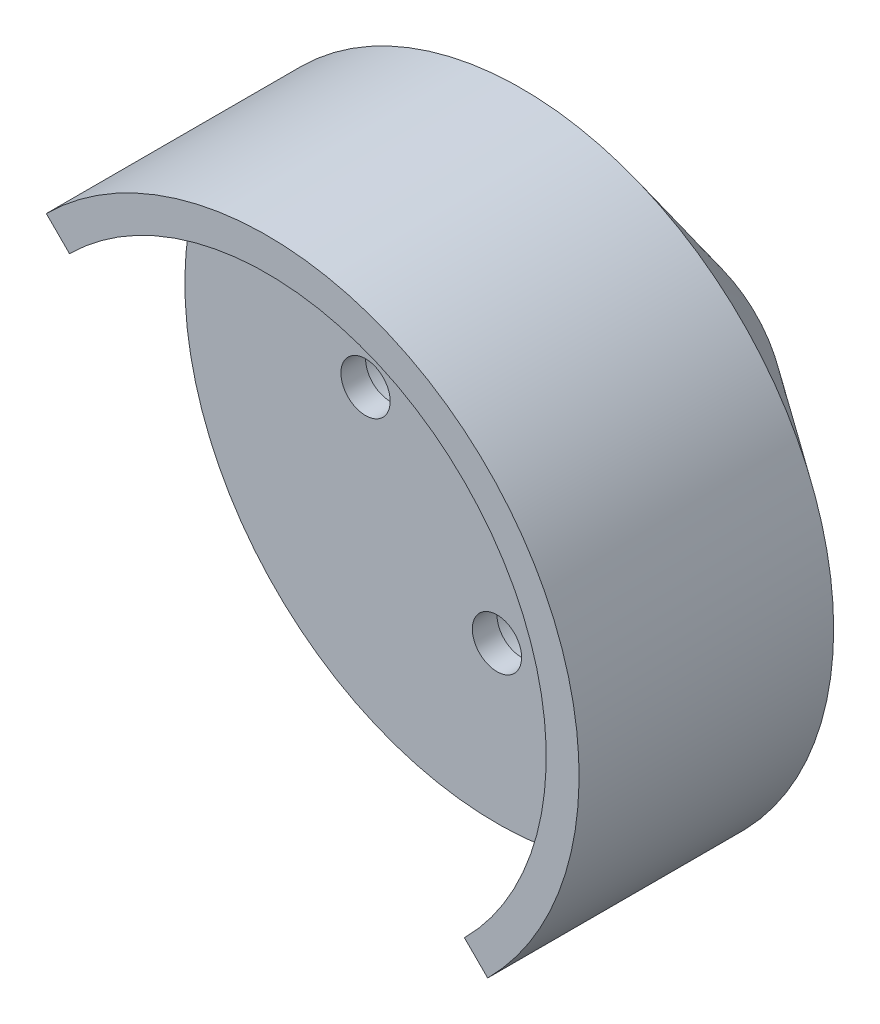
ISO-10303-21;
HEADER;
FILE_DESCRIPTION(('STEP AP214'),'2;1');
FILE_NAME('part.step','',(''),(''),'','','');
FILE_SCHEMA(('AUTOMOTIVE_DESIGN { 1 0 10303 214 1 1 1 1 }'));
ENDSEC;
DATA;
#1=APPLICATION_CONTEXT('core data for automotive mechanical design processes');
#2=APPLICATION_PROTOCOL_DEFINITION('international standard','automotive_design',2000,#1);
#3=PRODUCT_CONTEXT('',#1,'mechanical');
#4=PRODUCT('Part','Part','',(#3));
#5=PRODUCT_RELATED_PRODUCT_CATEGORY('part','',(#4));
#6=PRODUCT_DEFINITION_FORMATION('','',#4);
#7=PRODUCT_DEFINITION_CONTEXT('part definition',#1,'design');
#8=PRODUCT_DEFINITION('design','',#6,#7);
#9=PRODUCT_DEFINITION_SHAPE('','',#8);
#10=(LENGTH_UNIT() NAMED_UNIT(*) SI_UNIT(.MILLI.,.METRE.));
#11=(NAMED_UNIT(*) PLANE_ANGLE_UNIT() SI_UNIT($,.RADIAN.));
#12=(NAMED_UNIT(*) SI_UNIT($,.STERADIAN.) SOLID_ANGLE_UNIT());
#13=UNCERTAINTY_MEASURE_WITH_UNIT(LENGTH_MEASURE(1.E-05),#10,'distance_accuracy_value','');
#14=(GEOMETRIC_REPRESENTATION_CONTEXT(3) GLOBAL_UNCERTAINTY_ASSIGNED_CONTEXT((#13)) GLOBAL_UNIT_ASSIGNED_CONTEXT((#10,
#11,#12)) REPRESENTATION_CONTEXT('',''));
#15=CARTESIAN_POINT('',(0.,0.,0.));
#16=DIRECTION('',(0.,0.,1.));
#17=DIRECTION('',(1.,0.,0.));
#18=AXIS2_PLACEMENT_3D('',#15,#16,#17);
#19=CARTESIAN_POINT('',(-84.9570072855555,9.63980218475927,-10.));
#20=DIRECTION('',(0.,0.,-1.));
#21=DIRECTION('',(-1.,0.,0.));
#22=AXIS2_PLACEMENT_3D('',#19,#20,#21);
#23=PLANE('',#22);
#24=CARTESIAN_POINT('',(-84.9570072855555,9.63980218475927,-10.));
#25=DIRECTION('',(0.,0.,1.));
#26=DIRECTION('',(1.,0.,0.));
#27=AXIS2_PLACEMENT_3D('',#24,#25,#26);
#28=CIRCLE('',#27,6.00000000000001);
#29=CARTESIAN_POINT('',(-90.6445072855555,7.72869157833166,-10.));
#30=VERTEX_POINT('',#29);
#31=CARTESIAN_POINT('',(-79.2695072855555,7.72869157833166,-10.));
#32=VERTEX_POINT('',#31);
#33=EDGE_CURVE('E93',#30,#32,#28,.T.);
#34=ORIENTED_EDGE('',*,*,#33,.F.);
#35=CARTESIAN_POINT('',(-92.9570072855555,9.63980218475926,-10.));
#36=DIRECTION('',(0.,0.,-1.));
#37=DIRECTION('',(-1.,0.,0.));
#38=AXIS2_PLACEMENT_3D('',#35,#36,#37);
#39=CIRCLE('',#38,3.00000000000001);
#40=CARTESIAN_POINT('',(-90.6445072855498,11.55091279118,-10.));
#41=VERTEX_POINT('',#40);
#42=EDGE_CURVE('E104',#41,#30,#39,.T.);
#43=ORIENTED_EDGE('',*,*,#42,.F.);
#44=CARTESIAN_POINT('',(-79.2695072855555,11.5509127911869,-10.));
#45=VERTEX_POINT('',#44);
#46=EDGE_CURVE('E54',#45,#41,#28,.T.);
#47=ORIENTED_EDGE('',*,*,#46,.F.);
#48=CARTESIAN_POINT('',(-76.9570072855555,9.63980218475927,-10.));
#49=DIRECTION('',(0.,0.,-1.));
#50=DIRECTION('',(-1.,0.,0.));
#51=AXIS2_PLACEMENT_3D('',#48,#49,#50);
#52=CIRCLE('',#51,3.00000000000001);
#53=EDGE_CURVE('E102',#32,#45,#52,.T.);
#54=ORIENTED_EDGE('',*,*,#53,.F.);
#55=EDGE_LOOP('',(#34,#43,#47,#54));
#56=FACE_BOUND('',#55,.T.);
#57=ADVANCED_FACE('F33',(#56),#23,.T.);
#58=CARTESIAN_POINT('',(-84.9570072855555,9.63980218475927,0.));
#59=DIRECTION('',(0.,0.,1.));
#60=DIRECTION('',(1.,0.,0.));
#61=AXIS2_PLACEMENT_3D('',#58,#59,#60);
#62=PLANE('',#61);
#63=CARTESIAN_POINT('',(-84.9570072855555,0.139802184759267,0.));
#64=DIRECTION('',(0.,0.,1.));
#65=DIRECTION('',(1.,0.,0.));
#66=AXIS2_PLACEMENT_3D('',#63,#64,#65);
#67=CIRCLE('',#66,1.5);
#68=CARTESIAN_POINT('',(-83.4570072855555,0.139802184759267,0.));
#69=VERTEX_POINT('',#68);
#70=EDGE_CURVE('E151',#69,#69,#67,.T.);
#71=ORIENTED_EDGE('',*,*,#70,.T.);
#72=EDGE_LOOP('',(#71));
#73=FACE_BOUND('',#72,.T.);
#74=CARTESIAN_POINT('',(-84.9570072855555,0.139802184759267,0.));
#75=DIRECTION('',(0.,0.,-1.));
#76=DIRECTION('',(-1.,0.,0.));
#77=AXIS2_PLACEMENT_3D('',#74,#75,#76);
#78=CIRCLE('',#77,3.00000000000001);
#79=CARTESIAN_POINT('',(-87.9570072855555,0.139802184759267,0.));
#80=VERTEX_POINT('',#79);
#81=EDGE_CURVE('E109',#80,#80,#78,.T.);
#82=ORIENTED_EDGE('',*,*,#81,.T.);
#83=EDGE_LOOP('',(#82));
#84=FACE_BOUND('',#83,.T.);
#85=ADVANCED_FACE('F190',(#73,#84),#62,.F.);
#86=CARTESIAN_POINT('',(-76.9570072855555,9.63980218475927,0.));
#87=DIRECTION('',(0.,0.,1.));
#88=DIRECTION('',(1.,0.,0.));
#89=AXIS2_PLACEMENT_3D('',#86,#87,#88);
#90=CIRCLE('',#89,1.5);
#91=CARTESIAN_POINT('',(-75.4570072855555,9.63980218475927,0.));
#92=VERTEX_POINT('',#91);
#93=EDGE_CURVE('E147',#92,#92,#90,.T.);
#94=ORIENTED_EDGE('',*,*,#93,.T.);
#95=EDGE_LOOP('',(#94));
#96=FACE_BOUND('',#95,.T.);
#97=CARTESIAN_POINT('',(-76.9570072855555,9.63980218475927,0.));
#98=DIRECTION('',(0.,0.,-1.));
#99=DIRECTION('',(-1.,0.,0.));
#100=AXIS2_PLACEMENT_3D('',#97,#98,#99);
#101=CIRCLE('',#100,3.00000000000001);
#102=CARTESIAN_POINT('',(-79.9570072855555,9.63980218475927,0.));
#103=VERTEX_POINT('',#102);
#104=EDGE_CURVE('E110',#103,#103,#101,.T.);
#105=ORIENTED_EDGE('',*,*,#104,.T.);
#106=EDGE_LOOP('',(#105));
#107=FACE_BOUND('',#106,.T.);
#108=ADVANCED_FACE('F195',(#96,#107),#62,.F.);
#109=CARTESIAN_POINT('',(-92.9570072855555,9.63980218475926,0.));
#110=DIRECTION('',(0.,0.,1.));
#111=DIRECTION('',(1.,0.,0.));
#112=AXIS2_PLACEMENT_3D('',#109,#110,#111);
#113=CIRCLE('',#112,1.5);
#114=CARTESIAN_POINT('',(-91.4570072855555,9.63980218475926,0.));
#115=VERTEX_POINT('',#114);
#116=EDGE_CURVE('E157',#115,#115,#113,.T.);
#117=ORIENTED_EDGE('',*,*,#116,.T.);
#118=EDGE_LOOP('',(#117));
#119=FACE_BOUND('',#118,.T.);
#120=CARTESIAN_POINT('',(-92.9570072855555,9.63980218475926,0.));
#121=DIRECTION('',(0.,0.,-1.));
#122=DIRECTION('',(-1.,0.,0.));
#123=AXIS2_PLACEMENT_3D('',#120,#121,#122);
#124=CIRCLE('',#123,3.00000000000001);
#125=CARTESIAN_POINT('',(-95.9570072855555,9.63980218475926,0.));
#126=VERTEX_POINT('',#125);
#127=EDGE_CURVE('E118',#126,#126,#124,.T.);
#128=ORIENTED_EDGE('',*,*,#127,.T.);
#129=EDGE_LOOP('',(#128));
#130=FACE_BOUND('',#129,.T.);
#131=ADVANCED_FACE('F278',(#119,#130),#62,.F.);
#132=CARTESIAN_POINT('',(-84.9570072855555,19.1398021847593,0.));
#133=DIRECTION('',(0.,0.,1.));
#134=DIRECTION('',(1.,0.,0.));
#135=AXIS2_PLACEMENT_3D('',#132,#133,#134);
#136=CIRCLE('',#135,1.5);
#137=CARTESIAN_POINT('',(-83.4570072855555,19.1398021847593,0.));
#138=VERTEX_POINT('',#137);
#139=EDGE_CURVE('E163',#138,#138,#136,.T.);
#140=ORIENTED_EDGE('',*,*,#139,.T.);
#141=EDGE_LOOP('',(#140));
#142=FACE_BOUND('',#141,.T.);
#143=CARTESIAN_POINT('',(-84.9570072855555,19.1398021847593,0.));
#144=DIRECTION('',(0.,0.,-1.));
#145=DIRECTION('',(-1.,0.,0.));
#146=AXIS2_PLACEMENT_3D('',#143,#144,#145);
#147=CIRCLE('',#146,3.00000000000001);
#148=CARTESIAN_POINT('',(-87.9570072855555,19.1398021847593,0.));
#149=VERTEX_POINT('',#148);
#150=EDGE_CURVE('E241',#149,#149,#147,.T.);
#151=ORIENTED_EDGE('',*,*,#150,.T.);
#152=EDGE_LOOP('',(#151));
#153=FACE_BOUND('',#152,.T.);
#154=ADVANCED_FACE('F171',(#142,#153),#62,.F.);
#155=CARTESIAN_POINT('',(-84.9570072855555,9.63980218475927,1.5));
#156=DIRECTION('',(0.,0.,1.));
#157=DIRECTION('',(1.,0.,0.));
#158=AXIS2_PLACEMENT_3D('',#155,#156,#157);
#159=PLANE('',#158);
#160=DIRECTION('',(0.707106781186625,-0.70710678118647,0.));
#161=VECTOR('',#160,1.);
#162=CARTESIAN_POINT('',(-71.521978443011,-3.79522665778497,1.5));
#163=LINE('',#162,#161);
#164=CARTESIAN_POINT('',(-72.9361920053842,-2.38101309541203,1.5));
#165=VERTEX_POINT('',#164);
#166=CARTESIAN_POINT('',(-71.521978443011,-3.79522665778498,1.5));
#167=VERTEX_POINT('',#166);
#168=EDGE_CURVE('E61',#165,#167,#163,.T.);
#169=ORIENTED_EDGE('',*,*,#168,.F.);
#170=CARTESIAN_POINT('',(-84.9570072855555,9.63980218475927,1.5));
#171=DIRECTION('',(0.,0.,-1.));
#172=DIRECTION('',(-1.,0.,0.));
#173=AXIS2_PLACEMENT_3D('',#170,#171,#172);
#174=CIRCLE('',#173,17.);
#175=CARTESIAN_POINT('',(-96.9778225657268,21.6606174649306,1.5));
#176=VERTEX_POINT('',#175);
#177=EDGE_CURVE('E133',#176,#165,#174,.T.);
#178=ORIENTED_EDGE('',*,*,#177,.F.);
#179=DIRECTION('',(0.707106781186624,-0.707106781186471,0.));
#180=VECTOR('',#179,1.);
#181=CARTESIAN_POINT('',(-98.3920361281001,23.0748310273035,1.5));
#182=LINE('',#181,#180);
#183=CARTESIAN_POINT('',(-98.3920361281001,23.0748310273035,1.5));
#184=VERTEX_POINT('',#183);
#185=EDGE_CURVE('E113',#184,#176,#182,.T.);
#186=ORIENTED_EDGE('',*,*,#185,.F.);
#187=CARTESIAN_POINT('',(-84.9570072855555,9.63980218475927,1.5));
#188=DIRECTION('',(0.,0.,1.));
#189=DIRECTION('',(1.,0.,0.));
#190=AXIS2_PLACEMENT_3D('',#187,#188,#189);
#191=CIRCLE('',#190,19.);
#192=EDGE_CURVE('E11',#184,#167,#191,.T.);
#193=ORIENTED_EDGE('',*,*,#192,.T.);
#194=EDGE_LOOP('',(#169,#178,#186,#193));
#195=FACE_BOUND('',#194,.T.);
#196=CARTESIAN_POINT('',(-84.9570072855555,0.139802184759267,1.5));
#197=DIRECTION('',(0.,0.,1.));
#198=DIRECTION('',(1.,0.,0.));
#199=AXIS2_PLACEMENT_3D('',#196,#197,#198);
#200=CIRCLE('',#199,1.5);
#201=CARTESIAN_POINT('',(-83.4570072855555,0.139802184759267,1.5));
#202=VERTEX_POINT('',#201);
#203=EDGE_CURVE('E154',#202,#202,#200,.T.);
#204=ORIENTED_EDGE('',*,*,#203,.F.);
#205=EDGE_LOOP('',(#204));
#206=FACE_BOUND('',#205,.T.);
#207=CARTESIAN_POINT('',(-84.9570072855555,19.1398021847593,1.5));
#208=DIRECTION('',(0.,0.,1.));
#209=DIRECTION('',(1.,0.,0.));
#210=AXIS2_PLACEMENT_3D('',#207,#208,#209);
#211=CIRCLE('',#210,1.5);
#212=CARTESIAN_POINT('',(-83.4570072855555,19.1398021847593,1.5));
#213=VERTEX_POINT('',#212);
#214=EDGE_CURVE('E47',#213,#213,#211,.T.);
#215=ORIENTED_EDGE('',*,*,#214,.F.);
#216=EDGE_LOOP('',(#215));
#217=FACE_BOUND('',#216,.T.);
#218=CARTESIAN_POINT('',(-92.9570072855555,9.63980218475926,1.5));
#219=DIRECTION('',(0.,0.,1.));
#220=DIRECTION('',(1.,0.,0.));
#221=AXIS2_PLACEMENT_3D('',#218,#219,#220);
#222=CIRCLE('',#221,1.5);
#223=CARTESIAN_POINT('',(-91.4570072855555,9.63980218475926,1.5));
#224=VERTEX_POINT('',#223);
#225=EDGE_CURVE('E160',#224,#224,#222,.T.);
#226=ORIENTED_EDGE('',*,*,#225,.F.);
#227=EDGE_LOOP('',(#226));
#228=FACE_BOUND('',#227,.T.);
#229=CARTESIAN_POINT('',(-76.9570072855555,9.63980218475927,1.5));
#230=DIRECTION('',(0.,0.,1.));
#231=DIRECTION('',(1.,0.,0.));
#232=AXIS2_PLACEMENT_3D('',#229,#230,#231);
#233=CIRCLE('',#232,1.5);
#234=CARTESIAN_POINT('',(-75.4570072855555,9.63980218475927,1.5));
#235=VERTEX_POINT('',#234);
#236=EDGE_CURVE('E148',#235,#235,#233,.T.);
#237=ORIENTED_EDGE('',*,*,#236,.F.);
#238=EDGE_LOOP('',(#237));
#239=FACE_BOUND('',#238,.T.);
#240=ADVANCED_FACE('F186',(#195,#206,#217,#228,#239),#159,.T.);
#241=CARTESIAN_POINT('',(-84.9570072855555,9.63980218475927,1.5));
#242=DIRECTION('',(0.,0.,-1.));
#243=DIRECTION('',(-1.,0.,0.));
#244=AXIS2_PLACEMENT_3D('',#241,#242,#243);
#245=CYLINDRICAL_SURFACE('',#244,19.);
#246=CARTESIAN_POINT('',(-84.9570072855555,9.63980218475927,0.));
#247=DIRECTION('',(0.,0.,1.));
#248=DIRECTION('',(1.,0.,0.));
#249=AXIS2_PLACEMENT_3D('',#246,#247,#248);
#250=CIRCLE('',#249,19.);
#251=CARTESIAN_POINT('',(-65.9570072855555,9.63980218475927,0.));
#252=VERTEX_POINT('',#251);
#253=EDGE_CURVE('E105',#252,#252,#250,.T.);
#254=ORIENTED_EDGE('',*,*,#253,.T.);
#255=EDGE_LOOP('',(#254));
#256=FACE_BOUND('',#255,.T.);
#257=ORIENTED_EDGE('',*,*,#192,.F.);
#258=DIRECTION('',(0.,0.,-1.));
#259=VECTOR('',#258,1.);
#260=CARTESIAN_POINT('',(-98.3920361281001,23.0748310273035,15.5));
#261=LINE('',#260,#259);
#262=CARTESIAN_POINT('',(-98.3920361281001,23.0748310273035,15.5));
#263=VERTEX_POINT('',#262);
#264=EDGE_CURVE('E144',#263,#184,#261,.T.);
#265=ORIENTED_EDGE('',*,*,#264,.F.);
#266=CARTESIAN_POINT('',(-84.9570072855555,9.63980218475926,15.5));
#267=DIRECTION('',(0.,0.,1.));
#268=DIRECTION('',(-1.,0.,0.));
#269=AXIS2_PLACEMENT_3D('',#266,#267,#268);
#270=CIRCLE('',#269,19.);
#271=CARTESIAN_POINT('',(-71.521978443011,-3.79522665778497,15.5));
#272=VERTEX_POINT('',#271);
#273=EDGE_CURVE('E121',#272,#263,#270,.T.);
#274=ORIENTED_EDGE('',*,*,#273,.F.);
#275=DIRECTION('',(0.,0.,-1.));
#276=VECTOR('',#275,1.);
#277=CARTESIAN_POINT('',(-71.521978443011,-3.79522665778497,15.5));
#278=LINE('',#277,#276);
#279=EDGE_CURVE('E130',#272,#167,#278,.T.);
#280=ORIENTED_EDGE('',*,*,#279,.T.);
#281=EDGE_LOOP('',(#257,#265,#274,#280));
#282=FACE_BOUND('',#281,.T.);
#283=ADVANCED_FACE('F35',(#256,#282),#245,.T.);
#284=CARTESIAN_POINT('',(-84.9570072855555,19.1398021847593,1.5));
#285=DIRECTION('',(0.,0.,-1.));
#286=DIRECTION('',(-1.,0.,0.));
#287=AXIS2_PLACEMENT_3D('',#284,#285,#286);
#288=CYLINDRICAL_SURFACE('',#287,1.5);
#289=ORIENTED_EDGE('',*,*,#214,.T.);
#290=EDGE_LOOP('',(#289));
#291=FACE_BOUND('',#290,.T.);
#292=ORIENTED_EDGE('',*,*,#139,.F.);
#293=EDGE_LOOP('',(#292));
#294=FACE_BOUND('',#293,.T.);
#295=ADVANCED_FACE('F174',(#291,#294),#288,.F.);
#296=CARTESIAN_POINT('',(-92.9570072855555,9.63980218475926,1.5));
#297=DIRECTION('',(0.,0.,-1.));
#298=DIRECTION('',(-1.,0.,0.));
#299=AXIS2_PLACEMENT_3D('',#296,#297,#298);
#300=CYLINDRICAL_SURFACE('',#299,1.5);
#301=ORIENTED_EDGE('',*,*,#225,.T.);
#302=EDGE_LOOP('',(#301));
#303=FACE_BOUND('',#302,.T.);
#304=ORIENTED_EDGE('',*,*,#116,.F.);
#305=EDGE_LOOP('',(#304));
#306=FACE_BOUND('',#305,.T.);
#307=ADVANCED_FACE('F176',(#303,#306),#300,.F.);
#308=CARTESIAN_POINT('',(-84.9570072855555,0.139802184759267,1.5));
#309=DIRECTION('',(0.,0.,-1.));
#310=DIRECTION('',(-1.,0.,0.));
#311=AXIS2_PLACEMENT_3D('',#308,#309,#310);
#312=CYLINDRICAL_SURFACE('',#311,1.5);
#313=ORIENTED_EDGE('',*,*,#203,.T.);
#314=EDGE_LOOP('',(#313));
#315=FACE_BOUND('',#314,.T.);
#316=ORIENTED_EDGE('',*,*,#70,.F.);
#317=EDGE_LOOP('',(#316));
#318=FACE_BOUND('',#317,.T.);
#319=ADVANCED_FACE('F183',(#315,#318),#312,.F.);
#320=CARTESIAN_POINT('',(-76.9570072855555,9.63980218475927,1.5));
#321=DIRECTION('',(0.,0.,-1.));
#322=DIRECTION('',(-1.,0.,0.));
#323=AXIS2_PLACEMENT_3D('',#320,#321,#322);
#324=CYLINDRICAL_SURFACE('',#323,1.5);
#325=ORIENTED_EDGE('',*,*,#236,.T.);
#326=EDGE_LOOP('',(#325));
#327=FACE_BOUND('',#326,.T.);
#328=ORIENTED_EDGE('',*,*,#93,.F.);
#329=EDGE_LOOP('',(#328));
#330=FACE_BOUND('',#329,.T.);
#331=ADVANCED_FACE('F217',(#327,#330),#324,.F.);
#332=CARTESIAN_POINT('',(-98.3920361281001,23.0748310273035,15.5));
#333=DIRECTION('',(0.707106781186471,0.707106781186624,0.));
#334=DIRECTION('',(-0.707106781186624,0.707106781186471,0.));
#335=AXIS2_PLACEMENT_3D('',#332,#333,#334);
#336=PLANE('',#335);
#337=ORIENTED_EDGE('',*,*,#185,.T.);
#338=DIRECTION('',(0.,0.,-1.));
#339=VECTOR('',#338,1.);
#340=CARTESIAN_POINT('',(-96.9778225657268,21.6606174649306,15.5));
#341=LINE('',#340,#339);
#342=CARTESIAN_POINT('',(-96.9778225657268,21.6606174649306,15.5));
#343=VERTEX_POINT('',#342);
#344=EDGE_CURVE('E141',#343,#176,#341,.T.);
#345=ORIENTED_EDGE('',*,*,#344,.F.);
#346=DIRECTION('',(0.707106781186624,-0.707106781186471,0.));
#347=VECTOR('',#346,1.);
#348=CARTESIAN_POINT('',(-98.3920361281001,23.0748310273035,15.5));
#349=LINE('',#348,#347);
#350=EDGE_CURVE('E124',#263,#343,#349,.T.);
#351=ORIENTED_EDGE('',*,*,#350,.F.);
#352=ORIENTED_EDGE('',*,*,#264,.T.);
#353=EDGE_LOOP('',(#337,#345,#351,#352));
#354=FACE_BOUND('',#353,.T.);
#355=ADVANCED_FACE('F213',(#354),#336,.F.);
#356=CARTESIAN_POINT('',(-84.9570072855555,9.63980218475927,15.5));
#357=DIRECTION('',(0.,0.,-1.));
#358=DIRECTION('',(-1.,0.,0.));
#359=AXIS2_PLACEMENT_3D('',#356,#357,#358);
#360=CYLINDRICAL_SURFACE('',#359,17.);
#361=ORIENTED_EDGE('',*,*,#177,.T.);
#362=DIRECTION('',(0.,0.,-1.));
#363=VECTOR('',#362,1.);
#364=CARTESIAN_POINT('',(-72.9361920053842,-2.38101309541203,15.5));
#365=LINE('',#364,#363);
#366=CARTESIAN_POINT('',(-72.9361920053842,-2.38101309541203,15.5));
#367=VERTEX_POINT('',#366);
#368=EDGE_CURVE('E138',#367,#165,#365,.T.);
#369=ORIENTED_EDGE('',*,*,#368,.F.);
#370=CARTESIAN_POINT('',(-84.9570072855555,9.63980218475927,15.5));
#371=DIRECTION('',(0.,0.,-1.));
#372=DIRECTION('',(-1.,0.,0.));
#373=AXIS2_PLACEMENT_3D('',#370,#371,#372);
#374=CIRCLE('',#373,17.);
#375=EDGE_CURVE('E126',#343,#367,#374,.T.);
#376=ORIENTED_EDGE('',*,*,#375,.F.);
#377=ORIENTED_EDGE('',*,*,#344,.T.);
#378=EDGE_LOOP('',(#361,#369,#376,#377));
#379=FACE_BOUND('',#378,.T.);
#380=ADVANCED_FACE('F209',(#379),#360,.F.);
#381=CARTESIAN_POINT('',(-71.521978443011,-3.79522665778497,15.5));
#382=DIRECTION('',(0.70710678118647,0.707106781186625,0.));
#383=DIRECTION('',(-0.707106781186625,0.70710678118647,0.));
#384=AXIS2_PLACEMENT_3D('',#381,#382,#383);
#385=PLANE('',#384);
#386=ORIENTED_EDGE('',*,*,#168,.T.);
#387=ORIENTED_EDGE('',*,*,#279,.F.);
#388=DIRECTION('',(0.707106781186625,-0.70710678118647,0.));
#389=VECTOR('',#388,1.);
#390=CARTESIAN_POINT('',(-71.521978443011,-3.79522665778497,15.5));
#391=LINE('',#390,#389);
#392=EDGE_CURVE('E128',#367,#272,#391,.T.);
#393=ORIENTED_EDGE('',*,*,#392,.F.);
#394=ORIENTED_EDGE('',*,*,#368,.T.);
#395=EDGE_LOOP('',(#386,#387,#393,#394));
#396=FACE_BOUND('',#395,.T.);
#397=ADVANCED_FACE('F205',(#396),#385,.F.);
#398=CARTESIAN_POINT('',(-84.9570072855555,9.63980218475926,15.5));
#399=DIRECTION('',(0.,0.,-1.));
#400=DIRECTION('',(-1.,0.,0.));
#401=AXIS2_PLACEMENT_3D('',#398,#399,#400);
#402=PLANE('',#401);
#403=ORIENTED_EDGE('',*,*,#273,.T.);
#404=ORIENTED_EDGE('',*,*,#350,.T.);
#405=ORIENTED_EDGE('',*,*,#375,.T.);
#406=ORIENTED_EDGE('',*,*,#392,.T.);
#407=EDGE_LOOP('',(#403,#404,#405,#406));
#408=FACE_BOUND('',#407,.T.);
#409=ADVANCED_FACE('F202',(#408),#402,.F.);
#410=CARTESIAN_POINT('',(-84.9570072855555,0.139802184759267,-10.));
#411=DIRECTION('',(0.,0.,1.));
#412=DIRECTION('',(1.,0.,0.));
#413=AXIS2_PLACEMENT_3D('',#410,#411,#412);
#414=CYLINDRICAL_SURFACE('',#413,3.00000000000001);
#415=CARTESIAN_POINT('',(-87.260222171652,-1.7824884250247,-5.65216187547989));
#416=CARTESIAN_POINT('',(-87.1617674617473,-1.9004455637873,-5.57818534257135));
#417=CARTESIAN_POINT('',(-87.0527020082338,-2.01266100707916,-5.50872925725067));
#418=CARTESIAN_POINT('',(-86.8144894103972,-2.22131334389449,-5.38082968294662));
#419=CARTESIAN_POINT('',(-86.6853180835113,-2.3177309459284,-5.32239964538109));
#420=CARTESIAN_POINT('',(-86.4085534210988,-2.49073998606626,-5.21832759431523));
#421=CARTESIAN_POINT('',(-86.2608717017585,-2.56723048582099,-5.17275059389176));
#422=CARTESIAN_POINT('',(-85.9515607627998,-2.6954819224772,-5.09670583605656));
#423=CARTESIAN_POINT('',(-85.7899432853455,-2.74726344315876,-5.06622550158212));
#424=CARTESIAN_POINT('',(-85.4729131563977,-2.81957134238826,-5.02375895163553));
#425=CARTESIAN_POINT('',(-85.3182279069017,-2.84246873908784,-5.01036850745028));
#426=CARTESIAN_POINT('',(-85.0066220395328,-2.86384489230864,-4.99786580887071));
#427=CARTESIAN_POINT('',(-84.8497022345713,-2.86233231311821,-4.99874848825048));
#428=CARTESIAN_POINT('',(-84.548604748274,-2.83586720352584,-5.01423204975942));
#429=CARTESIAN_POINT('',(-84.4042476910656,-2.81239928333943,-5.02796407574704));
#430=CARTESIAN_POINT('',(-84.1220306222251,-2.74530635080925,-5.06738336858786));
#431=CARTESIAN_POINT('',(-83.9841704945914,-2.70168169851083,-5.09307042189697));
#432=CARTESIAN_POINT('',(-83.7158580479642,-2.59529649263585,-5.15607989696433));
#433=CARTESIAN_POINT('',(-83.5855885750159,-2.53219879284773,-5.19360760019667));
#434=CARTESIAN_POINT('',(-83.3379334151335,-2.38982678742654,-5.27893758672018));
#435=CARTESIAN_POINT('',(-83.2205513771578,-2.31054791831764,-5.32674276870882));
#436=CARTESIAN_POINT('',(-82.9908837558598,-2.13118791709852,-5.43590326175195));
#437=CARTESIAN_POINT('',(-82.8799370584046,-2.02989512804469,-5.49807703232061));
#438=CARTESIAN_POINT('',(-82.676733065563,-1.81524890629072,-5.63139211528216));
#439=CARTESIAN_POINT('',(-82.5844839721068,-1.70189021384647,-5.7025373410103));
#440=CARTESIAN_POINT('',(-82.4080423802279,-1.4506077571385,-5.86236443856322));
#441=CARTESIAN_POINT('',(-82.3266082222423,-1.31143174847368,-5.95211766383903));
#442=CARTESIAN_POINT('',(-82.1883203651571,-1.02618962328441,-6.13922026248134));
#443=CARTESIAN_POINT('',(-82.1314805497319,-0.88011966654099,-6.23657388982153));
#444=CARTESIAN_POINT('',(-82.0346521813298,-0.561450521712278,-6.45296045762989));
#445=CARTESIAN_POINT('',(-81.9987265070637,-0.388295767457696,-6.57299321595454));
#446=CARTESIAN_POINT('',(-81.9574698252328,-0.04231241163014,-6.81856773718854));
#447=CARTESIAN_POINT('',(-81.9521514313737,0.13051602613607,-6.9441117498931));
#448=CARTESIAN_POINT('',(-81.9719205216879,0.497262574082887,-7.21739012660619));
#449=CARTESIAN_POINT('',(-82.0016091536291,0.690530776980197,-7.36566593469062));
#450=CARTESIAN_POINT('',(-82.0972998486258,1.06709501138938,-7.66377854088492));
#451=CARTESIAN_POINT('',(-82.1633514201913,1.25037707194633,-7.8136171933471));
#452=CARTESIAN_POINT('',(-82.292317152683,1.52207712885035,-8.04316669098811));
#453=CARTESIAN_POINT('',(-82.3429892773218,1.61572032520803,-8.12377088415287));
#454=CARTESIAN_POINT('',(-82.454616163677,1.79794811808657,-8.28353692415902));
#455=CARTESIAN_POINT('',(-82.5155666602747,1.88653479253886,-8.36269935423953));
#456=CARTESIAN_POINT('',(-82.6476930969836,2.05781086450484,-8.51862552506264));
#457=CARTESIAN_POINT('',(-82.7188582854783,2.14050632764092,-8.59539168587364));
#458=CARTESIAN_POINT('',(-82.8715209497649,2.29916745117171,-8.74541453481968));
#459=CARTESIAN_POINT('',(-82.9530121136911,2.37513717496164,-8.81867332949313));
#460=CARTESIAN_POINT('',(-83.1475422969917,2.53677442149179,-8.97736215216706));
#461=CARTESIAN_POINT('',(-83.2634476620653,2.62035422822724,-9.06145976720564));
#462=CARTESIAN_POINT('',(-83.5117085592841,2.77271945799261,-9.21787914414152));
#463=CARTESIAN_POINT('',(-83.6440344605258,2.84153093505604,-9.29022158860483));
#464=CARTESIAN_POINT('',(-83.8938142499963,2.94760678685451,-9.40354503526935));
#465=CARTESIAN_POINT('',(-84.0081685270377,2.98848003569331,-9.44792449735892));
#466=CARTESIAN_POINT('',(-84.2452193791429,3.05673957925394,-9.52271852912215));
#467=CARTESIAN_POINT('',(-84.3679076626663,3.08413906173702,-9.55314675191358));
#468=CARTESIAN_POINT('',(-84.6198894881658,3.12354441441675,-9.59708892979098));
#469=CARTESIAN_POINT('',(-84.7492297596346,3.1354193859423,-9.61045903279224));
#470=CARTESIAN_POINT('',(-85.0088982605035,3.14215959204147,-9.61803339023359));
#471=CARTESIAN_POINT('',(-85.1392260325446,3.13703227182562,-9.61224603362237));
#472=CARTESIAN_POINT('',(-85.379719934621,3.11202000921307,-9.58423291668185));
#473=CARTESIAN_POINT('',(-85.4903593728182,3.0940733615358,-9.56416741285597));
#474=CARTESIAN_POINT('',(-85.7061824225409,3.04685542632668,-9.51189112917341));
#475=CARTESIAN_POINT('',(-85.8113629810519,3.01757787748545,-9.47967363453431));
#476=CARTESIAN_POINT('',(-86.056317925731,2.93521838125626,-9.39018076039206));
#477=CARTESIAN_POINT('',(-86.1926827095114,2.87729792506226,-9.32804518263811));
#478=CARTESIAN_POINT('',(-86.4501518502007,2.7458578760831,-9.1900968199451));
#479=CARTESIAN_POINT('',(-86.5712187986845,2.67230118097555,-9.11425156934189));
#480=CARTESIAN_POINT('',(-86.841826982621,2.48169130427355,-8.92229902172731));
#481=CARTESIAN_POINT('',(-86.9842614049294,2.3588203185623,-8.80196796506929));
#482=CARTESIAN_POINT('',(-87.2402314077434,2.09448473317869,-8.55173434832734));
#483=CARTESIAN_POINT('',(-87.3537430402515,1.95300487140156,-8.42182397059434));
#484=CARTESIAN_POINT('',(-87.5547278583253,1.65156929494172,-8.15396130770671));
#485=CARTESIAN_POINT('',(-87.6414778319661,1.49123963963143,-8.01588910540211));
#486=CARTESIAN_POINT('',(-87.7845000369079,1.15865176003439,-7.73842481154846));
#487=CARTESIAN_POINT('',(-87.8407704835819,0.98639283793516,-7.59903264319931));
#488=CARTESIAN_POINT('',(-87.9283171647186,0.604319070327746,-7.29886434644645));
#489=CARTESIAN_POINT('',(-87.953964014358,0.392985513250506,-7.13833981332962));
#490=CARTESIAN_POINT('',(-87.9595382706517,-0.0349773885097707,-6.8232343526317));
#491=CARTESIAN_POINT('',(-87.9394572877267,-0.251607697762238,-6.66865452100217));
#492=CARTESIAN_POINT('',(-87.859167400885,-0.640591482576903,-6.39856675300738));
#493=CARTESIAN_POINT('',(-87.8074066736938,-0.813457524388993,-6.28125686522146));
#494=CARTESIAN_POINT('',(-87.6708549654398,-1.1517444654686,-6.0561355890803));
#495=CARTESIAN_POINT('',(-87.5861742873881,-1.3171881908032,-5.94829393992206));
#496=CARTESIAN_POINT('',(-87.4511423727965,-1.52849985468329,-5.81282654331671));
#497=CARTESIAN_POINT('',(-87.415551498956,-1.5805405546911,-5.77966188840485));
#498=CARTESIAN_POINT('',(-87.3406668519773,-1.68288521336867,-5.71478841746655));
#499=CARTESIAN_POINT('',(-87.3013712634027,-1.73318830387975,-5.68308032664387));
#500=CARTESIAN_POINT('',(-87.260222171652,-1.7824884250247,-5.65216187547989));
#501=B_SPLINE_CURVE_WITH_KNOTS('',3,(#415,#416,#417,#418,#419,#420,#421,#422,#423,#424,#425,
#426,#427,#428,#429,#430,#431,#432,#433,#434,#435,#436,#437,#438,#439,#440,#441,#442,#443,#444,
#445,#446,#447,#448,#449,#450,#451,#452,#453,#454,#455,#456,#457,#458,#459,#460,#461,#462,#463,
#464,#465,#466,#467,#468,#469,#470,#471,#472,#473,#474,#475,#476,#477,#478,#479,#480,#481,#482,
#483,#484,#485,#486,#487,#488,#489,#490,#491,#492,#493,#494,#495,#496,#497,#498,#499,#500),
.UNSPECIFIED.,.T.,.F.,(4,2,2,2,2,2,2,2,2,2,2,2,2,2,2,2,2,2,2,2,2,2,2,2,2,2,2,2,2,2,2,2,2,2,2,2,
2,2,2,2,2,2,4),(0.,0.511347494954617,1.02331484021079,1.53782717337381,2.05191014124487,
2.52025204268262,2.98842771044527,3.42707086877783,3.86570619224293,4.31240778161267,
4.75923552599758,5.24506020603288,5.73109753989859,6.28259437251245,6.83440212397757,
7.47310089573451,8.11206286571172,8.84528316569851,9.57950423030781,9.97971617241523,
10.3797624491821,10.7793906981203,11.1787758377671,11.674597829182,12.1695377757892,
12.5559699440452,12.9420231262801,13.3313108518661,13.720428133002,14.0605788758217,
14.4009178505361,14.8802154243682,15.3606632503236,16.0270022958285,16.6938912885219,
17.3774799644155,18.0611086612338,18.8571179741072,19.6532733407289,20.2965111176124,
20.9376119565915,21.1512241335394,21.3649415372751),.UNSPECIFIED.);
#502=CARTESIAN_POINT('',(-87.260222171652,-1.7824884250247,-5.65216187547989));
#503=VERTEX_POINT('',#502);
#504=EDGE_CURVE('E97',#503,#503,#501,.T.);
#505=ORIENTED_EDGE('',*,*,#504,.F.);
#506=EDGE_LOOP('',(#505));
#507=FACE_BOUND('',#506,.T.);
#508=ORIENTED_EDGE('',*,*,#81,.F.);
#509=EDGE_LOOP('',(#508));
#510=FACE_BOUND('',#509,.T.);
#511=ADVANCED_FACE('F199',(#507,#510),#414,.F.);
#512=CARTESIAN_POINT('',(-76.9570072855555,9.63980218475927,-10.));
#513=DIRECTION('',(0.,0.,1.));
#514=DIRECTION('',(1.,0.,0.));
#515=AXIS2_PLACEMENT_3D('',#512,#513,#514);
#516=CYLINDRICAL_SURFACE('',#515,3.00000000000001);
#517=CARTESIAN_POINT('',(-79.2697022813305,7.72892755346674,-10.0002));
#518=CARTESIAN_POINT('',(-79.2015227761287,7.64646349204994,-9.93023642394995));
#519=CARTESIAN_POINT('',(-79.1298469744499,7.56864988904866,-9.85834146038722));
#520=CARTESIAN_POINT('',(-78.9802830942218,7.42229330734524,-9.71178645058103));
#521=CARTESIAN_POINT('',(-78.9023998513429,7.35374322232975,-9.63712858049921));
#522=CARTESIAN_POINT('',(-78.7412289850577,7.22586353853796,-9.48616074940948));
#523=CARTESIAN_POINT('',(-78.6579506272416,7.16651869611801,-9.40985376335039));
#524=CARTESIAN_POINT('',(-78.486493592896,7.05696816137437,-9.25620220070271));
#525=CARTESIAN_POINT('',(-78.3983138427872,7.00676448166897,-9.17885739963246));
#526=CARTESIAN_POINT('',(-78.131574415082,6.87224120184645,-8.94988118738709));
#527=CARTESIAN_POINT('',(-77.9468338960045,6.80089797746349,-8.79757333694888));
#528=CARTESIAN_POINT('',(-77.565238014204,6.69543631318484,-8.49493842473183));
#529=CARTESIAN_POINT('',(-77.368369288982,6.66135973637541,-8.34461377757473));
#530=CARTESIAN_POINT('',(-76.9541099227229,6.63214894248399,-8.03909661823924));
#531=CARTESIAN_POINT('',(-76.7362346490605,6.63982410659229,-7.88426952691687));
#532=CARTESIAN_POINT('',(-76.3008494552278,6.70421007741672,-7.58475323817385));
#533=CARTESIAN_POINT('',(-76.0833395257616,6.76083990286487,-7.44004772462745));
#534=CARTESIAN_POINT('',(-75.7127549259233,6.90470190307408,-7.20014702378427));
#535=CARTESIAN_POINT('',(-75.5573196915989,6.98054227417269,-7.1016980397363));
#536=CARTESIAN_POINT('',(-75.2573961924177,7.16151913022474,-6.91506413687858));
#537=CARTESIAN_POINT('',(-75.1129043559611,7.26664600407383,-6.82687586419498));
#538=CARTESIAN_POINT('',(-74.9086684049937,7.44602789229434,-6.70402983329671));
#539=CARTESIAN_POINT('',(-74.8424182319438,7.50975563508671,-6.66450595014846));
#540=CARTESIAN_POINT('',(-74.7151362566433,7.64416629798536,-6.58908424025926));
#541=CARTESIAN_POINT('',(-74.654101738278,7.71484555624556,-6.55318452440128));
#542=CARTESIAN_POINT('',(-74.5381237494393,7.86277179819577,-6.48537292991403));
#543=CARTESIAN_POINT('',(-74.4831784069872,7.94001675043657,-6.45345982530588));
#544=CARTESIAN_POINT('',(-74.3802220906222,8.10056037581815,-6.39396437794355));
#545=CARTESIAN_POINT('',(-74.3322098296698,8.18385792104421,-6.36638123130408));
#546=CARTESIAN_POINT('',(-74.2498193260887,8.34436572209769,-6.31924530206972));
#547=CARTESIAN_POINT('',(-74.214477056918,8.42091230487355,-6.29911240657725));
#548=CARTESIAN_POINT('',(-74.1501213881124,8.5774685639781,-6.26256066141097));
#549=CARTESIAN_POINT('',(-74.121106996354,8.65747769506635,-6.24614122950253));
#550=CARTESIAN_POINT('',(-74.0698558013517,8.82027251562132,-6.21720296217295));
#551=CARTESIAN_POINT('',(-74.0476144642143,8.90305630633847,-6.20468151730759));
#552=CARTESIAN_POINT('',(-74.0102311426528,9.07068242702063,-6.18366791555745));
#553=CARTESIAN_POINT('',(-73.9950884822237,9.15552456016067,-6.17517537500039));
#554=CARTESIAN_POINT('',(-73.9633145617295,9.3925989755353,-6.15736669081227));
#555=CARTESIAN_POINT('',(-73.9545479740738,9.54632359359908,-6.15247001844795));
#556=CARTESIAN_POINT('',(-73.9606618047914,9.85303488106423,-6.15589095007754));
#557=CARTESIAN_POINT('',(-73.9755349798589,10.0060217621055,-6.16420450641112));
#558=CARTESIAN_POINT('',(-74.0270990805415,10.3010133318666,-6.19313795164059));
#559=CARTESIAN_POINT('',(-74.0629421304708,10.4432145039474,-6.2132797036863));
#560=CARTESIAN_POINT('',(-74.1540913536237,10.7190492868709,-6.26479134681934));
#561=CARTESIAN_POINT('',(-74.209399169877,10.8526821733348,-6.29616218576267));
#562=CARTESIAN_POINT('',(-74.339502752926,11.1131079590369,-6.37051943550934));
#563=CARTESIAN_POINT('',(-74.4149401321416,11.2394688720703,-6.4138904269017));
#564=CARTESIAN_POINT('',(-74.5812244490541,11.4773947968314,-6.51043473575269));
#565=CARTESIAN_POINT('',(-74.6720761656862,11.588955200758,-6.56361109363215));
#566=CARTESIAN_POINT('',(-74.8753363935553,11.8056180063502,-6.68396961770473));
#567=CARTESIAN_POINT('',(-74.9889744213948,11.9090899413358,-6.75200383841245));
#568=CARTESIAN_POINT('',(-75.2270795036414,12.0954575061354,-6.8966724103002));
#569=CARTESIAN_POINT('',(-75.3515516741071,12.1783433428879,-6.97331082952851));
#570=CARTESIAN_POINT('',(-75.6250368078688,12.3330788756175,-7.14451426723933));
#571=CARTESIAN_POINT('',(-75.7750973542004,12.4019394982109,-7.24010357686905));
#572=CARTESIAN_POINT('',(-76.0800562333783,12.5133628300582,-7.43850378410617));
#573=CARTESIAN_POINT('',(-76.234956576962,12.5559144521826,-7.54131770600897));
#574=CARTESIAN_POINT('',(-76.5693017538115,12.620215014455,-7.76844408918395));
#575=CARTESIAN_POINT('',(-76.7489234788177,12.6378564019381,-7.89365966735073));
#576=CARTESIAN_POINT('',(-77.1049034173002,12.6414460869783,-8.14920929797633));
#577=CARTESIAN_POINT('',(-77.2812583977262,12.6273645189879,-8.27954806015705));
#578=CARTESIAN_POINT('',(-77.6504726144805,12.565347000623,-8.56126486607691));
#579=CARTESIAN_POINT('',(-77.842268029211,12.5130232907746,-8.71307208171989));
#580=CARTESIAN_POINT('',(-78.2115773419618,12.3720359359355,-9.01710764620052));
#581=CARTESIAN_POINT('',(-78.3891002121416,12.2833953379354,-9.16933566724843));
#582=CARTESIAN_POINT('',(-78.6230303649698,12.1358853391804,-9.37842233594631));
#583=CARTESIAN_POINT('',(-78.6874566024758,12.091678589895,-9.43699659778665));
#584=CARTESIAN_POINT('',(-78.813176279462,11.9979329621235,-9.55322744648937));
#585=CARTESIAN_POINT('',(-78.8744705778406,11.9483955572093,-9.61088428192621));
#586=CARTESIAN_POINT('',(-78.9936275511308,11.843993231714,-9.72489410113166));
#587=CARTESIAN_POINT('',(-79.0514906296706,11.7891289397668,-9.78124723778211));
#588=CARTESIAN_POINT('',(-79.1634888518242,11.6739788455525,-9.89218573862317));
#589=CARTESIAN_POINT('',(-79.2176217292813,11.6136897980514,-9.94677001772327));
#590=CARTESIAN_POINT('',(-79.2697022813305,11.5506768160518,-10.0002));
#591=B_SPLINE_CURVE_WITH_KNOTS('',3,(#517,#518,#519,#520,#521,#522,#523,#524,#525,#526,#527,
#528,#529,#530,#531,#532,#533,#534,#535,#536,#537,#538,#539,#540,#541,#542,#543,#544,#545,#546,
#547,#548,#549,#550,#551,#552,#553,#554,#555,#556,#557,#558,#559,#560,#561,#562,#563,#564,#565,
#566,#567,#568,#569,#570,#571,#572,#573,#574,#575,#576,#577,#578,#579,#580,#581,#582,#583,#584,
#585,#586,#587,#588,#589,#590),.UNSPECIFIED.,.F.,.F.,(4,2,2,2,2,2,2,2,2,2,2,2,2,2,2,2,2,2,2,2,2,
2,2,2,2,2,2,2,2,2,2,2,2,2,2,2,4),(0.,0.383265043155435,0.766234382993303,1.14856260464188,
1.53097490233115,2.27716320084934,3.02418886365741,3.82207622063684,4.6186462249146,
5.21335358441945,5.80786600515506,6.10768805648497,6.40735300810213,6.70692557748089,
7.00644246328732,7.26612672978464,7.52577025206838,7.78523958456378,8.0446842028484,
8.50429070044415,8.96375640015239,9.40581598001889,9.84791288328242,10.3062604854466,
10.764750450491,11.266964560205,11.7694171237455,12.3395292209462,12.9098814111194,
13.5662911527539,14.2233191289686,14.970666791039,15.7175409130526,16.0103509791046,
16.3030803095726,16.5957751365121,16.888646240499),.UNSPECIFIED.);
#592=EDGE_CURVE('E89',#32,#45,#591,.T.);
#593=ORIENTED_EDGE('',*,*,#592,.F.);
#594=ORIENTED_EDGE('',*,*,#53,.T.);
#595=EDGE_LOOP('',(#593,#594));
#596=FACE_BOUND('',#595,.T.);
#597=ORIENTED_EDGE('',*,*,#104,.F.);
#598=EDGE_LOOP('',(#597));
#599=FACE_BOUND('',#598,.T.);
#600=ADVANCED_FACE('F107',(#596,#599),#516,.F.);
#601=CARTESIAN_POINT('',(-92.9570072855555,9.63980218475926,-10.));
#602=DIRECTION('',(0.,0.,1.));
#603=DIRECTION('',(1.,0.,0.));
#604=AXIS2_PLACEMENT_3D('',#601,#602,#603);
#605=CYLINDRICAL_SURFACE('',#604,3.00000000000001);
#606=CARTESIAN_POINT('',(-90.6443122897805,11.5506768160518,-10.0002));
#607=CARTESIAN_POINT('',(-90.7124917949823,11.6331408774686,-9.93023642394995));
#608=CARTESIAN_POINT('',(-90.7841675966611,11.7109544804699,-9.85834146038722));
#609=CARTESIAN_POINT('',(-90.9337314768892,11.8573110621733,-9.71178645058103));
#610=CARTESIAN_POINT('',(-91.0116147197681,11.9258611471888,-9.63712858049921));
#611=CARTESIAN_POINT('',(-91.1727855860534,12.0537408309806,-9.48616074940948));
#612=CARTESIAN_POINT('',(-91.2560639438694,12.1130856734005,-9.40985376335039));
#613=CARTESIAN_POINT('',(-91.427520978215,12.2226362081442,-9.25620220070272));
#614=CARTESIAN_POINT('',(-91.5157007283238,12.2728398878496,-9.17885739963246));
#615=CARTESIAN_POINT('',(-91.782440156029,12.4073631676721,-8.94988118738708));
#616=CARTESIAN_POINT('',(-91.9671806751065,12.478706392055,-8.79757333694887));
#617=CARTESIAN_POINT('',(-92.3487765569071,12.5841680563337,-8.49493842473183));
#618=CARTESIAN_POINT('',(-92.545645282129,12.6182446331431,-8.34461377757473));
#619=CARTESIAN_POINT('',(-92.9599046483881,12.6474554270345,-8.03909661823924));
#620=CARTESIAN_POINT('',(-93.1777799220505,12.6397802629262,-7.88426952691687));
#621=CARTESIAN_POINT('',(-93.6131651158833,12.5753942921018,-7.58475323817385));
#622=CARTESIAN_POINT('',(-93.8306750453495,12.5187644666537,-7.44004772462746));
#623=CARTESIAN_POINT('',(-94.2012596451877,12.3749024664444,-7.20014702378427));
#624=CARTESIAN_POINT('',(-94.3566948795121,12.2990620953458,-7.10169803973629));
#625=CARTESIAN_POINT('',(-94.6566183786934,12.1180852392938,-6.91506413687857));
#626=CARTESIAN_POINT('',(-94.8011102151499,12.0129583654447,-6.82687586419497));
#627=CARTESIAN_POINT('',(-95.0053461661173,11.8335764772242,-6.70402983329671));
#628=CARTESIAN_POINT('',(-95.0715963391672,11.7698487344318,-6.66450595014845));
#629=CARTESIAN_POINT('',(-95.1988783144677,11.6354380715332,-6.58908424025926));
#630=CARTESIAN_POINT('',(-95.259912832833,11.5647588132729,-6.55318452440127));
#631=CARTESIAN_POINT('',(-95.3758908216718,11.4168325713227,-6.48537292991402));
#632=CARTESIAN_POINT('',(-95.4308361641239,11.3395876190819,-6.45345982530587));
#633=CARTESIAN_POINT('',(-95.5337924804889,11.1790439937004,-6.39396437794355));
#634=CARTESIAN_POINT('',(-95.5818047414412,11.0957464484743,-6.36638123130408));
#635=CARTESIAN_POINT('',(-95.6641952450223,10.9352386474208,-6.31924530206971));
#636=CARTESIAN_POINT('',(-95.699537514193,10.858692064645,-6.29911240657725));
#637=CARTESIAN_POINT('',(-95.7638931829986,10.7021358055404,-6.26256066141097));
#638=CARTESIAN_POINT('',(-95.792907574757,10.6221266744522,-6.24614122950253));
#639=CARTESIAN_POINT('',(-95.8441587697593,10.4593318538972,-6.21720296217295));
#640=CARTESIAN_POINT('',(-95.8664001068967,10.37654806318,-6.20468151730758));
#641=CARTESIAN_POINT('',(-95.9037834284582,10.2089219424979,-6.18366791555745));
#642=CARTESIAN_POINT('',(-95.9189260888873,10.1240798093578,-6.17517537500039));
#643=CARTESIAN_POINT('',(-95.9507000093815,9.88700539398321,-6.15736669081227));
#644=CARTESIAN_POINT('',(-95.9594665970372,9.73328077591944,-6.15247001844795));
#645=CARTESIAN_POINT('',(-95.9533527663196,9.42656948845428,-6.15589095007754));
#646=CARTESIAN_POINT('',(-95.9384795912521,9.27358260741302,-6.16420450641112));
#647=CARTESIAN_POINT('',(-95.8869154905695,8.97859103765192,-6.19313795164059));
#648=CARTESIAN_POINT('',(-95.8510724406402,8.83638986557107,-6.2132797036863));
#649=CARTESIAN_POINT('',(-95.7599232174873,8.56055508264757,-6.26479134681935));
#650=CARTESIAN_POINT('',(-95.704615401234,8.42692219618373,-6.29616218576267));
#651=CARTESIAN_POINT('',(-95.574511818185,8.16649641048165,-6.37051943550935));
#652=CARTESIAN_POINT('',(-95.4990744389695,8.04013549744818,-6.4138904269017));
#653=CARTESIAN_POINT('',(-95.3327901220569,7.80220957268712,-6.51043473575269));
#654=CARTESIAN_POINT('',(-95.2419384054248,7.69064916876055,-6.56361109363216));
#655=CARTESIAN_POINT('',(-95.0386781775557,7.47398636316836,-6.68396961770473));
#656=CARTESIAN_POINT('',(-94.9250401497162,7.37051442818276,-6.75200383841246));
#657=CARTESIAN_POINT('',(-94.6869350674696,7.18414686338309,-6.89667241030021));
#658=CARTESIAN_POINT('',(-94.5624628970039,7.10126102663061,-6.97331082952853));
#659=CARTESIAN_POINT('',(-94.2889777632422,6.94652549390101,-7.14451426723935));
#660=CARTESIAN_POINT('',(-94.1389172169106,6.87766487130766,-7.24010357686906));
#661=CARTESIAN_POINT('',(-93.8339583377327,6.7662415394603,-7.43850378410619));
#662=CARTESIAN_POINT('',(-93.679057994149,6.72368991733597,-7.54131770600898));
#663=CARTESIAN_POINT('',(-93.3447128172995,6.65938935506354,-7.76844408918396));
#664=CARTESIAN_POINT('',(-93.1650910922933,6.64174796758045,-7.89365966735074));
#665=CARTESIAN_POINT('',(-92.8091111538108,6.63815828254019,-8.14920929797635));
#666=CARTESIAN_POINT('',(-92.6327561733848,6.65223985053059,-8.27954806015707));
#667=CARTESIAN_POINT('',(-92.2635419566305,6.71425736889556,-8.56126486607693));
#668=CARTESIAN_POINT('',(-92.0717465419,6.76658107874396,-8.71307208171991));
#669=CARTESIAN_POINT('',(-91.7024372291492,6.90756843358306,-9.01710764620054));
#670=CARTESIAN_POINT('',(-91.5249143589694,6.9962090315831,-9.16933566724846));
#671=CARTESIAN_POINT('',(-91.2909842061412,7.14371903033812,-9.37842233594633));
#672=CARTESIAN_POINT('',(-91.2265579686352,7.18792577962356,-9.43699659778667));
#673=CARTESIAN_POINT('',(-91.100838291649,7.28167140739501,-9.55322744648938));
#674=CARTESIAN_POINT('',(-91.0395439932704,7.33120881230925,-9.61088428192622));
#675=CARTESIAN_POINT('',(-90.9203870199802,7.43561113780451,-9.72489410113166));
#676=CARTESIAN_POINT('',(-90.8625239414404,7.49047542975174,-9.78124723778212));
#677=CARTESIAN_POINT('',(-90.7505257192868,7.60562552396598,-9.89218573862316));
#678=CARTESIAN_POINT('',(-90.6963928418297,7.66591457146708,-9.94677001772326));
#679=CARTESIAN_POINT('',(-90.6443122897805,7.72892755346673,-10.0002));
#680=B_SPLINE_CURVE_WITH_KNOTS('',3,(#606,#607,#608,#609,#610,#611,#612,#613,#614,#615,#616,
#617,#618,#619,#620,#621,#622,#623,#624,#625,#626,#627,#628,#629,#630,#631,#632,#633,#634,#635,
#636,#637,#638,#639,#640,#641,#642,#643,#644,#645,#646,#647,#648,#649,#650,#651,#652,#653,#654,
#655,#656,#657,#658,#659,#660,#661,#662,#663,#664,#665,#666,#667,#668,#669,#670,#671,#672,#673,
#674,#675,#676,#677,#678,#679),.UNSPECIFIED.,.F.,.F.,(4,2,2,2,2,2,2,2,2,2,2,2,2,2,2,2,2,2,2,2,2,
2,2,2,2,2,2,2,2,2,2,2,2,2,2,2,4),(0.,0.383265043155434,0.766234382993303,1.14856260464187,
1.53097490233115,2.27716320084936,3.0241888636574,3.82207622063684,4.6186462249146,
5.21335358441945,5.80786600515508,6.10768805648497,6.40735300810216,6.7069255774809,
7.00644246328732,7.26612672978465,7.52577025206838,7.78523958456379,8.04468420284841,
8.50429070044416,8.96375640015241,9.4058159800189,9.84791288328244,10.3062604854466,
10.7647504504911,11.2669645602051,11.7694171237455,12.3395292209462,12.9098814111194,
13.5662911527539,14.2233191289686,14.970666791039,15.7175409130527,16.0103509791046,
16.3030803095726,16.5957751365121,16.888646240499),.UNSPECIFIED.);
#681=EDGE_CURVE('E98',#41,#30,#680,.T.);
#682=ORIENTED_EDGE('',*,*,#681,.F.);
#683=ORIENTED_EDGE('',*,*,#42,.T.);
#684=EDGE_LOOP('',(#682,#683));
#685=FACE_BOUND('',#684,.T.);
#686=ORIENTED_EDGE('',*,*,#127,.F.);
#687=EDGE_LOOP('',(#686));
#688=FACE_BOUND('',#687,.T.);
#689=ADVANCED_FACE('F237',(#685,#688),#605,.F.);
#690=CARTESIAN_POINT('',(-84.9570072855555,19.1398021847593,-10.));
#691=DIRECTION('',(0.,0.,1.));
#692=DIRECTION('',(1.,0.,0.));
#693=AXIS2_PLACEMENT_3D('',#690,#691,#692);
#694=CYLINDRICAL_SURFACE('',#693,3.00000000000001);
#695=CARTESIAN_POINT('',(-86.7325758446436,16.7216698571713,-8.99918214492456));
#696=CARTESIAN_POINT('',(-86.627261345581,16.6443386726325,-9.07658458415562));
#697=CARTESIAN_POINT('',(-86.5150066849146,16.5724801138676,-9.15012700952067));
#698=CARTESIAN_POINT('',(-86.2766692816684,16.4422344135094,-9.28577750837403));
#699=CARTESIAN_POINT('',(-86.1506095483828,16.3838253447276,-9.34790415951629));
#700=CARTESIAN_POINT('',(-85.9082603676226,16.2921916250585,-9.44670213780497));
#701=CARTESIAN_POINT('',(-85.7940104715627,16.2563646453037,-9.48591268806591));
#702=CARTESIAN_POINT('',(-85.5582664563701,16.1981730751148,-9.55008275425508));
#703=CARTESIAN_POINT('',(-85.4367792088452,16.1757959315794,-9.57505555753978));
#704=CARTESIAN_POINT('',(-85.1887902679925,16.1461503418004,-9.6082231032326));
#705=CARTESIAN_POINT('',(-85.0622602688401,16.1389848694963,-9.61630348847557));
#706=CARTESIAN_POINT('',(-84.8094663934886,16.1407685240569,-9.61429820189018));
#707=CARTESIAN_POINT('',(-84.6832024934043,16.1497161370281,-9.60421423668047));
#708=CARTESIAN_POINT('',(-84.4483366402635,16.1811157788711,-9.56912632521568));
#709=CARTESIAN_POINT('',(-84.3392677246996,16.2020591017779,-9.54579139754536));
#710=CARTESIAN_POINT('',(-84.1270329392439,16.2548204364819,-9.48762185812621));
#711=CARTESIAN_POINT('',(-84.0238700825918,16.2866439425728,-9.45278143661689));
#712=CARTESIAN_POINT('',(-83.7785625515791,16.3765887770507,-9.35559516906495));
#713=CARTESIAN_POINT('',(-83.6404709527929,16.4400647661444,-9.28798190366905));
#714=CARTESIAN_POINT('',(-83.3807295145604,16.5829601986899,-9.139270944538));
#715=CARTESIAN_POINT('',(-83.2591222791064,16.6624196843542,-9.0581394741213));
#716=CARTESIAN_POINT('',(-82.9893202465231,16.8667646457535,-8.85458833595352));
#717=CARTESIAN_POINT('',(-82.8485345570924,16.997448863142,-8.72817979897513));
#718=CARTESIAN_POINT('',(-82.5974649678761,17.2775529563757,-8.46652175740955));
#719=CARTESIAN_POINT('',(-82.487201810496,17.4269854733971,-8.33126631746751));
#720=CARTESIAN_POINT('',(-82.2948355786482,17.7441103956913,-8.05365555873955));
#721=CARTESIAN_POINT('',(-82.2134131804843,17.9121349390349,-7.9112092430272));
#722=CARTESIAN_POINT('',(-82.0829551451674,18.2598521351605,-7.62572812156641));
#723=CARTESIAN_POINT('',(-82.0339266131412,18.4395473382471,-7.48269319363226));
#724=CARTESIAN_POINT('',(-81.9652543812182,18.8323786693914,-7.17914443312757));
#725=CARTESIAN_POINT('',(-81.9506538475584,19.046686809189,-7.01897052199011));
#726=CARTESIAN_POINT('',(-81.9683947832245,19.4786481034523,-6.70578230247993));
#727=CARTESIAN_POINT('',(-82.0007030031184,19.6962987805266,-6.55276300217501));
#728=CARTESIAN_POINT('',(-82.1032363553736,20.0816804502181,-6.28888150688459));
#729=CARTESIAN_POINT('',(-82.1642171382573,20.2504099399486,-6.17585413843104));
#730=CARTESIAN_POINT('',(-82.318711221494,20.579351803142,-5.95953386578395));
#731=CARTESIAN_POINT('',(-82.4122144239517,20.7395668024923,-5.85623795270486));
#732=CARTESIAN_POINT('',(-82.5772794735172,20.9689862019043,-5.71061000935414));
#733=CARTESIAN_POINT('',(-82.6367761171597,21.0439692788058,-5.66342003469823));
#734=CARTESIAN_POINT('',(-82.7639097792678,21.1890974077453,-5.57274829540937));
#735=CARTESIAN_POINT('',(-82.8315422826445,21.2592451095381,-5.5292644966761));
#736=CARTESIAN_POINT('',(-82.9746701624549,21.3936831338426,-5.44646883862258));
#737=CARTESIAN_POINT('',(-83.0501623944009,21.4579757796681,-5.40715532348464));
#738=CARTESIAN_POINT('',(-83.2085937337983,21.5796834149601,-5.33315445540516));
#739=CARTESIAN_POINT('',(-83.2915311060514,21.6370999997492,-5.29846602917905));
#740=CARTESIAN_POINT('',(-83.4513759470768,21.7360594788856,-5.23896463788387));
#741=CARTESIAN_POINT('',(-83.5273488433749,21.7786933841899,-5.21345014905936));
#742=CARTESIAN_POINT('',(-83.683700360883,21.8575870280225,-5.16639834043721));
#743=CARTESIAN_POINT('',(-83.7640780884703,21.8938480532041,-5.14486021778625));
#744=CARTESIAN_POINT('',(-83.928543919173,21.9593920326146,-5.10603556881562));
#745=CARTESIAN_POINT('',(-84.0126286407198,21.98868119671,-5.08874525850736));
#746=CARTESIAN_POINT('',(-84.1837707454603,22.0398185512727,-5.05861898812613));
#747=CARTESIAN_POINT('',(-84.2708277059571,22.0616677949981,-5.04578239754202));
#748=CARTESIAN_POINT('',(-84.5104968237126,22.1103998997543,-5.01718637887558));
#749=CARTESIAN_POINT('',(-84.6653114972694,22.1296392198224,-5.00594231376987));
#750=CARTESIAN_POINT('',(-84.9763038500853,22.1437785137211,-4.99767482895522));
#751=CARTESIAN_POINT('',(-85.132480888754,22.13868936977,-5.00064505113993));
#752=CARTESIAN_POINT('',(-85.4318552194423,22.1055750839245,-5.02002628670735));
#753=CARTESIAN_POINT('',(-85.5752649512119,22.0789609006577,-5.03561050461571));
#754=CARTESIAN_POINT('',(-85.8550479756868,22.0058858666212,-5.07858685293122));
#755=CARTESIAN_POINT('',(-85.9914211504188,21.9594246832225,-5.10597918123836));
#756=CARTESIAN_POINT('',(-86.2570870610496,21.8473988395316,-5.17243108493621));
#757=CARTESIAN_POINT('',(-86.3861282923593,21.7813987245104,-5.2117571866175));
#758=CARTESIAN_POINT('',(-86.6308802196563,21.6335175747408,-5.30057741772004));
#759=CARTESIAN_POINT('',(-86.7465869086217,21.5516317860899,-5.35007459117117));
#760=CARTESIAN_POINT('',(-86.9728754588992,21.3668011178423,-5.46286941438843));
#761=CARTESIAN_POINT('',(-87.0820156920851,21.2626139827449,-5.52701612131806));
#762=CARTESIAN_POINT('',(-87.2811664396392,21.0425224068251,-5.66418094812453));
#763=CARTESIAN_POINT('',(-87.3711685014474,20.9266128218792,-5.7372029655855));
#764=CARTESIAN_POINT('',(-87.542655243483,20.6699628815129,-5.90112080549349));
#765=CARTESIAN_POINT('',(-87.6212734906081,20.5279983784597,-5.99309411973895));
#766=CARTESIAN_POINT('',(-87.7534778697001,20.2376377210352,-6.18451760492028));
#767=CARTESIAN_POINT('',(-87.8070490526062,20.0892377833309,-6.28397219997696));
#768=CARTESIAN_POINT('',(-87.8964465551103,19.7659647145678,-6.50480362493875));
#769=CARTESIAN_POINT('',(-87.9281292671296,19.5906149881895,-6.62716067893227));
#770=CARTESIAN_POINT('',(-87.9604460921453,19.2409163806012,-6.87715200574975));
#771=CARTESIAN_POINT('',(-87.9610715704931,19.0665677912023,-7.00478773629993));
#772=CARTESIAN_POINT('',(-87.9308264863078,18.6977358445722,-7.2819210671188));
#773=CARTESIAN_POINT('',(-87.8953818433744,18.5039928719347,-7.43190796090931));
#774=CARTESIAN_POINT('',(-87.7877585639882,18.1272221994719,-7.73305636232071));
#775=CARTESIAN_POINT('',(-87.7155069174203,17.9442166059237,-7.88421961424642));
#776=CARTESIAN_POINT('',(-87.5741997937508,17.6691063056207,-8.11917719137756));
#777=CARTESIAN_POINT('',(-87.5170543499238,17.5716675812251,-8.20406958589552));
#778=CARTESIAN_POINT('',(-87.3912142758895,17.382665906454,-8.37198360128514));
#779=CARTESIAN_POINT('',(-87.3225152027224,17.2911052352772,-8.45500448848544));
#780=CARTESIAN_POINT('',(-87.1737212362952,17.1150971652713,-8.617763377316));
#781=CARTESIAN_POINT('',(-87.0936544985384,17.0306329888779,-8.69750888036336));
#782=CARTESIAN_POINT('',(-86.9218985730088,16.869772601879,-8.8523335409815));
#783=CARTESIAN_POINT('',(-86.8302202407604,16.7933689763097,-8.92741696060566));
#784=CARTESIAN_POINT('',(-86.7325758446436,16.7216698571713,-8.99918214492456));
#785=B_SPLINE_CURVE_WITH_KNOTS('',3,(#695,#696,#697,#698,#699,#700,#701,#702,#703,#704,#705,
#706,#707,#708,#709,#710,#711,#712,#713,#714,#715,#716,#717,#718,#719,#720,#721,#722,#723,#724,
#725,#726,#727,#728,#729,#730,#731,#732,#733,#734,#735,#736,#737,#738,#739,#740,#741,#742,#743,
#744,#745,#746,#747,#748,#749,#750,#751,#752,#753,#754,#755,#756,#757,#758,#759,#760,#761,#762,
#763,#764,#765,#766,#767,#768,#769,#770,#771,#772,#773,#774,#775,#776,#777,#778,#779,#780,#781,
#782,#783,#784),.UNSPECIFIED.,.T.,.F.,(4,2,2,2,2,2,2,2,2,2,2,2,2,2,2,2,2,2,2,2,2,2,2,2,2,2,2,2,
2,2,2,2,2,2,2,2,2,2,2,2,2,2,2,2,4),(0.,0.455297620308061,0.909847612203903,1.2863411143022,
1.66248267681365,2.04116247909636,2.41980670464227,2.75888792013637,3.09814061898104,
3.59438772271055,4.09189387598734,4.77809138776438,5.46475408500263,6.16668521082337,
6.86877024403452,7.66863101805275,8.46792511880632,9.101591244478,9.73506079834908,
10.0548234722951,10.3744095019138,10.6938681606535,11.0132525572495,11.2851902198852,
11.5570729164073,11.8287125320194,12.1003136760246,12.5668612113881,13.033200077724,
13.4712323203471,13.9092719045299,14.3579214062779,14.8067053773138,15.2966209717878,
15.7867524948957,16.3441841148184,16.9019480082209,17.5478799041863,18.193991383555,
18.9336667247555,19.6748150271799,20.0982134129228,20.5217749908044,20.944305219748,
21.3664433069447),.UNSPECIFIED.);
#786=CARTESIAN_POINT('',(-86.7325758446436,16.7216698571713,-8.99918214492456));
#787=VERTEX_POINT('',#786);
#788=EDGE_CURVE('E37',#787,#787,#785,.T.);
#789=ORIENTED_EDGE('',*,*,#788,.F.);
#790=EDGE_LOOP('',(#789));
#791=FACE_BOUND('',#790,.T.);
#792=ORIENTED_EDGE('',*,*,#150,.F.);
#793=EDGE_LOOP('',(#792));
#794=FACE_BOUND('',#793,.T.);
#795=ADVANCED_FACE('F255',(#791,#794),#694,.F.);
#796=CARTESIAN_POINT('',(-84.9570072855555,9.63980218475927,-10.));
#797=DIRECTION('',(0.,0.,1.));
#798=DIRECTION('',(1.,0.,0.));
#799=AXIS2_PLACEMENT_3D('',#796,#797,#798);
#800=CONICAL_SURFACE('',#799,6.00000000000001,0.91510070055336);
#801=ORIENTED_EDGE('',*,*,#504,.T.);
#802=EDGE_LOOP('',(#801));
#803=FACE_BOUND('',#802,.T.);
#804=ORIENTED_EDGE('',*,*,#592,.T.);
#805=ORIENTED_EDGE('',*,*,#46,.T.);
#806=ORIENTED_EDGE('',*,*,#681,.T.);
#807=ORIENTED_EDGE('',*,*,#33,.T.);
#808=EDGE_LOOP('',(#804,#805,#806,#807));
#809=FACE_BOUND('',#808,.T.);
#810=ORIENTED_EDGE('',*,*,#788,.T.);
#811=EDGE_LOOP('',(#810));
#812=FACE_BOUND('',#811,.T.);
#813=ORIENTED_EDGE('',*,*,#253,.F.);
#814=EDGE_LOOP('',(#813));
#815=FACE_BOUND('',#814,.T.);
#816=ADVANCED_FACE('F90',(#803,#809,#812,#815),#800,.T.);
#817=CLOSED_SHELL('',(#57,#85,#108,#131,#154,#240,#283,#295,#307,#319,#331,#355,#380,#397,#409,
#511,#600,#689,#795,#816));
#818=MANIFOLD_SOLID_BREP('B2',#817);
#819=ADVANCED_BREP_SHAPE_REPRESENTATION('',(#18,#818),#14);
#820=SHAPE_DEFINITION_REPRESENTATION(#9,#819);
ENDSEC;
END-ISO-10303-21;
